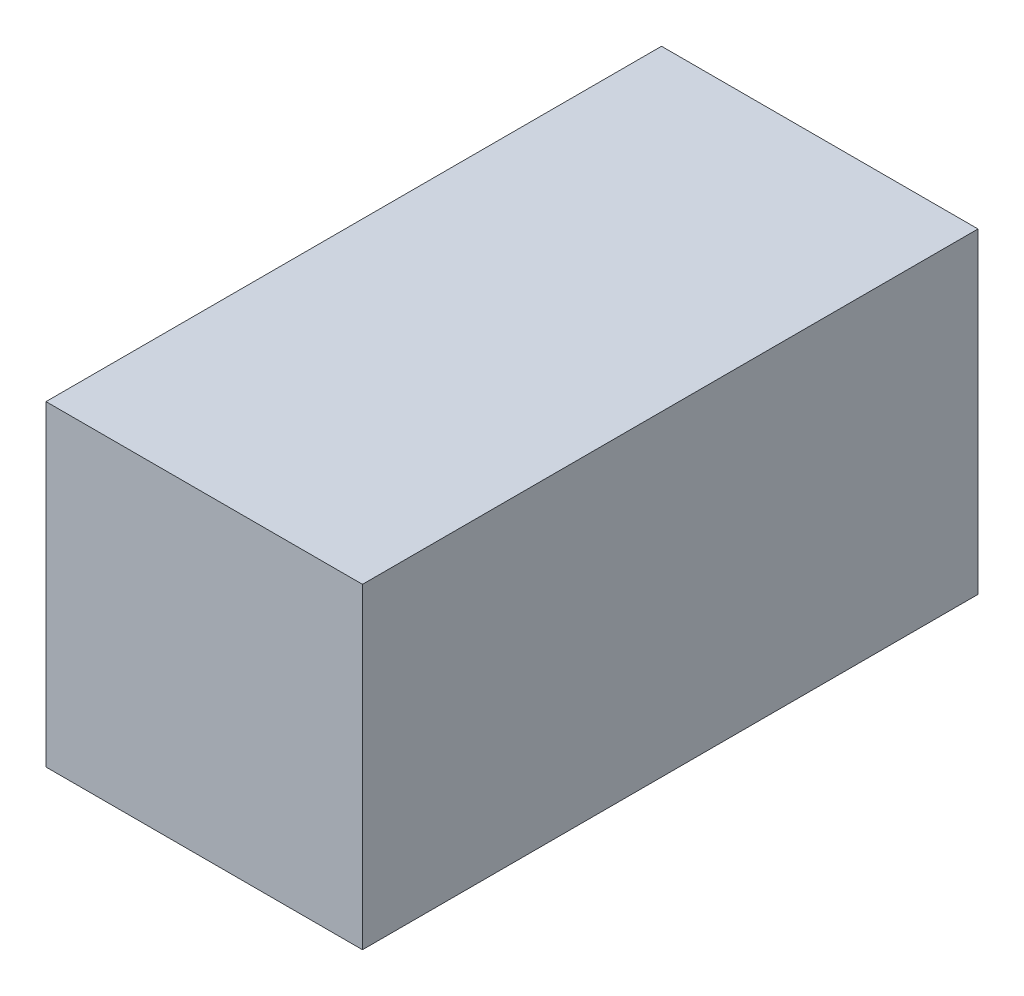
ISO-10303-21;
HEADER;
FILE_DESCRIPTION(('STEP AP214'),'2;1');
FILE_NAME('part.step','',(''),(''),'','','');
FILE_SCHEMA(('AUTOMOTIVE_DESIGN { 1 0 10303 214 1 1 1 1 }'));
ENDSEC;
DATA;
#1=APPLICATION_CONTEXT('core data for automotive mechanical design processes');
#2=APPLICATION_PROTOCOL_DEFINITION('international standard','automotive_design',2000,#1);
#3=PRODUCT_CONTEXT('',#1,'mechanical');
#4=PRODUCT('Part','Part','',(#3));
#5=PRODUCT_RELATED_PRODUCT_CATEGORY('part','',(#4));
#6=PRODUCT_DEFINITION_FORMATION('','',#4);
#7=PRODUCT_DEFINITION_CONTEXT('part definition',#1,'design');
#8=PRODUCT_DEFINITION('design','',#6,#7);
#9=PRODUCT_DEFINITION_SHAPE('','',#8);
#10=(LENGTH_UNIT() NAMED_UNIT(*) SI_UNIT(.MILLI.,.METRE.));
#11=(NAMED_UNIT(*) PLANE_ANGLE_UNIT() SI_UNIT($,.RADIAN.));
#12=(NAMED_UNIT(*) SI_UNIT($,.STERADIAN.) SOLID_ANGLE_UNIT());
#13=UNCERTAINTY_MEASURE_WITH_UNIT(LENGTH_MEASURE(1.E-05),#10,'distance_accuracy_value','');
#14=(GEOMETRIC_REPRESENTATION_CONTEXT(3) GLOBAL_UNCERTAINTY_ASSIGNED_CONTEXT((#13)) GLOBAL_UNIT_ASSIGNED_CONTEXT((#10,
#11,#12)) REPRESENTATION_CONTEXT('',''));
#15=CARTESIAN_POINT('',(0.,0.,0.));
#16=DIRECTION('',(0.,0.,1.));
#17=DIRECTION('',(1.,0.,0.));
#18=AXIS2_PLACEMENT_3D('',#15,#16,#17);
#19=CARTESIAN_POINT('',(2.38125,2.38125,-304.8));
#20=DIRECTION('',(1.,0.,0.));
#21=DIRECTION('',(0.,1.,0.));
#22=AXIS2_PLACEMENT_3D('',#19,#20,#21);
#23=PLANE('',#22);
#24=DIRECTION('',(0.,1.,0.));
#25=VECTOR('',#24,1.);
#26=CARTESIAN_POINT('',(2.38125,-2.38125,-304.8));
#27=LINE('',#26,#25);
#28=CARTESIAN_POINT('',(2.38125,-2.38125,-304.8));
#29=VERTEX_POINT('',#28);
#30=CARTESIAN_POINT('',(2.38125,2.38125,-304.8));
#31=VERTEX_POINT('',#30);
#32=EDGE_CURVE('E56',#29,#31,#27,.T.);
#33=ORIENTED_EDGE('',*,*,#32,.T.);
#34=DIRECTION('',(0.,0.,1.));
#35=VECTOR('',#34,1.);
#36=CARTESIAN_POINT('',(2.38125,2.38125,-304.8));
#37=LINE('',#36,#35);
#38=CARTESIAN_POINT('',(2.38125,2.38125,-295.5375));
#39=VERTEX_POINT('',#38);
#40=EDGE_CURVE('E69',#39,#31,#37,.F.);
#41=ORIENTED_EDGE('',*,*,#40,.F.);
#42=DIRECTION('',(0.,1.,0.));
#43=VECTOR('',#42,1.);
#44=CARTESIAN_POINT('',(2.38125,-2.38125,-295.5375));
#45=LINE('',#44,#43);
#46=CARTESIAN_POINT('',(2.38125,-2.38125,-295.5375));
#47=VERTEX_POINT('',#46);
#48=EDGE_CURVE('E20',#47,#39,#45,.T.);
#49=ORIENTED_EDGE('',*,*,#48,.F.);
#50=DIRECTION('',(0.,0.,-1.));
#51=VECTOR('',#50,1.);
#52=CARTESIAN_POINT('',(2.38125,-2.38125,-304.8));
#53=LINE('',#52,#51);
#54=EDGE_CURVE('E90',#29,#47,#53,.F.);
#55=ORIENTED_EDGE('',*,*,#54,.F.);
#56=EDGE_LOOP('',(#33,#41,#49,#55));
#57=FACE_BOUND('',#56,.T.);
#58=ADVANCED_FACE('F17',(#57),#23,.T.);
#59=CARTESIAN_POINT('',(-2.38125,-2.38125,-295.5375));
#60=DIRECTION('',(0.,0.,1.));
#61=DIRECTION('',(1.,0.,0.));
#62=AXIS2_PLACEMENT_3D('',#59,#60,#61);
#63=PLANE('',#62);
#64=ORIENTED_EDGE('',*,*,#48,.T.);
#65=DIRECTION('',(1.,0.,0.));
#66=VECTOR('',#65,1.);
#67=CARTESIAN_POINT('',(-2.38125,2.38125,-295.5375));
#68=LINE('',#67,#66);
#69=CARTESIAN_POINT('',(-2.38125,2.38125,-295.5375));
#70=VERTEX_POINT('',#69);
#71=EDGE_CURVE('E63',#70,#39,#68,.T.);
#72=ORIENTED_EDGE('',*,*,#71,.F.);
#73=DIRECTION('',(0.,1.,0.));
#74=VECTOR('',#73,1.);
#75=CARTESIAN_POINT('',(-2.38125,2.38125,-295.5375));
#76=LINE('',#75,#74);
#77=CARTESIAN_POINT('',(-2.38125,-2.38125,-295.5375));
#78=VERTEX_POINT('',#77);
#79=EDGE_CURVE('E93',#78,#70,#76,.T.);
#80=ORIENTED_EDGE('',*,*,#79,.F.);
#81=DIRECTION('',(1.,0.,0.));
#82=VECTOR('',#81,1.);
#83=CARTESIAN_POINT('',(-2.38125,-2.38125,-295.5375));
#84=LINE('',#83,#82);
#85=EDGE_CURVE('E66',#47,#78,#84,.F.);
#86=ORIENTED_EDGE('',*,*,#85,.F.);
#87=EDGE_LOOP('',(#64,#72,#80,#86));
#88=FACE_BOUND('',#87,.T.);
#89=ADVANCED_FACE('F61',(#88),#63,.T.);
#90=CARTESIAN_POINT('',(-2.38125,2.38125,-304.8));
#91=DIRECTION('',(0.,1.,0.));
#92=DIRECTION('',(0.,0.,1.));
#93=AXIS2_PLACEMENT_3D('',#90,#91,#92);
#94=PLANE('',#93);
#95=DIRECTION('',(1.,0.,0.));
#96=VECTOR('',#95,1.);
#97=CARTESIAN_POINT('',(-2.38125,2.38125,-304.8));
#98=LINE('',#97,#96);
#99=CARTESIAN_POINT('',(-2.38125,2.38125,-304.8));
#100=VERTEX_POINT('',#99);
#101=EDGE_CURVE('E84',#31,#100,#98,.F.);
#102=ORIENTED_EDGE('',*,*,#101,.T.);
#103=DIRECTION('',(0.,0.,1.));
#104=VECTOR('',#103,1.);
#105=CARTESIAN_POINT('',(-2.38125,2.38125,-304.8));
#106=LINE('',#105,#104);
#107=EDGE_CURVE('E76',#70,#100,#106,.F.);
#108=ORIENTED_EDGE('',*,*,#107,.F.);
#109=ORIENTED_EDGE('',*,*,#71,.T.);
#110=ORIENTED_EDGE('',*,*,#40,.T.);
#111=EDGE_LOOP('',(#102,#108,#109,#110));
#112=FACE_BOUND('',#111,.T.);
#113=ADVANCED_FACE('F74',(#112),#94,.T.);
#114=CARTESIAN_POINT('',(-2.38125,-2.38125,-304.8));
#115=DIRECTION('',(0.,0.,1.));
#116=DIRECTION('',(1.,0.,0.));
#117=AXIS2_PLACEMENT_3D('',#114,#115,#116);
#118=PLANE('',#117);
#119=ORIENTED_EDGE('',*,*,#101,.F.);
#120=ORIENTED_EDGE('',*,*,#32,.F.);
#121=DIRECTION('',(1.,0.,0.));
#122=VECTOR('',#121,1.);
#123=CARTESIAN_POINT('',(-2.38125,-2.38125,-304.8));
#124=LINE('',#123,#122);
#125=CARTESIAN_POINT('',(-2.38125,-2.38125,-304.8));
#126=VERTEX_POINT('',#125);
#127=EDGE_CURVE('E36',#126,#29,#124,.T.);
#128=ORIENTED_EDGE('',*,*,#127,.F.);
#129=DIRECTION('',(0.,1.,0.));
#130=VECTOR('',#129,1.);
#131=CARTESIAN_POINT('',(-2.38125,2.38125,-304.8));
#132=LINE('',#131,#130);
#133=EDGE_CURVE('E27',#100,#126,#132,.F.);
#134=ORIENTED_EDGE('',*,*,#133,.F.);
#135=EDGE_LOOP('',(#119,#120,#128,#134));
#136=FACE_BOUND('',#135,.T.);
#137=ADVANCED_FACE('F102',(#136),#118,.F.);
#138=CARTESIAN_POINT('',(-2.38125,-2.38125,-304.8));
#139=DIRECTION('',(0.,-1.,0.));
#140=DIRECTION('',(0.,0.,-1.));
#141=AXIS2_PLACEMENT_3D('',#138,#139,#140);
#142=PLANE('',#141);
#143=ORIENTED_EDGE('',*,*,#127,.T.);
#144=ORIENTED_EDGE('',*,*,#54,.T.);
#145=ORIENTED_EDGE('',*,*,#85,.T.);
#146=DIRECTION('',(0.,0.,1.));
#147=VECTOR('',#146,1.);
#148=CARTESIAN_POINT('',(-2.38125,-2.38125,-304.8));
#149=LINE('',#148,#147);
#150=EDGE_CURVE('E11',#126,#78,#149,.T.);
#151=ORIENTED_EDGE('',*,*,#150,.F.);
#152=EDGE_LOOP('',(#143,#144,#145,#151));
#153=FACE_BOUND('',#152,.T.);
#154=ADVANCED_FACE('F104',(#153),#142,.T.);
#155=CARTESIAN_POINT('',(-2.38125,2.38125,-304.8));
#156=DIRECTION('',(-1.,0.,0.));
#157=DIRECTION('',(0.,0.,1.));
#158=AXIS2_PLACEMENT_3D('',#155,#156,#157);
#159=PLANE('',#158);
#160=ORIENTED_EDGE('',*,*,#133,.T.);
#161=ORIENTED_EDGE('',*,*,#150,.T.);
#162=ORIENTED_EDGE('',*,*,#79,.T.);
#163=ORIENTED_EDGE('',*,*,#107,.T.);
#164=EDGE_LOOP('',(#160,#161,#162,#163));
#165=FACE_BOUND('',#164,.T.);
#166=ADVANCED_FACE('F101',(#165),#159,.T.);
#167=CLOSED_SHELL('',(#58,#89,#113,#137,#154,#166));
#168=MANIFOLD_SOLID_BREP('B1',#167);
#169=ADVANCED_BREP_SHAPE_REPRESENTATION('',(#18,#168),#14);
#170=SHAPE_DEFINITION_REPRESENTATION(#9,#169);
ENDSEC;
END-ISO-10303-21;
